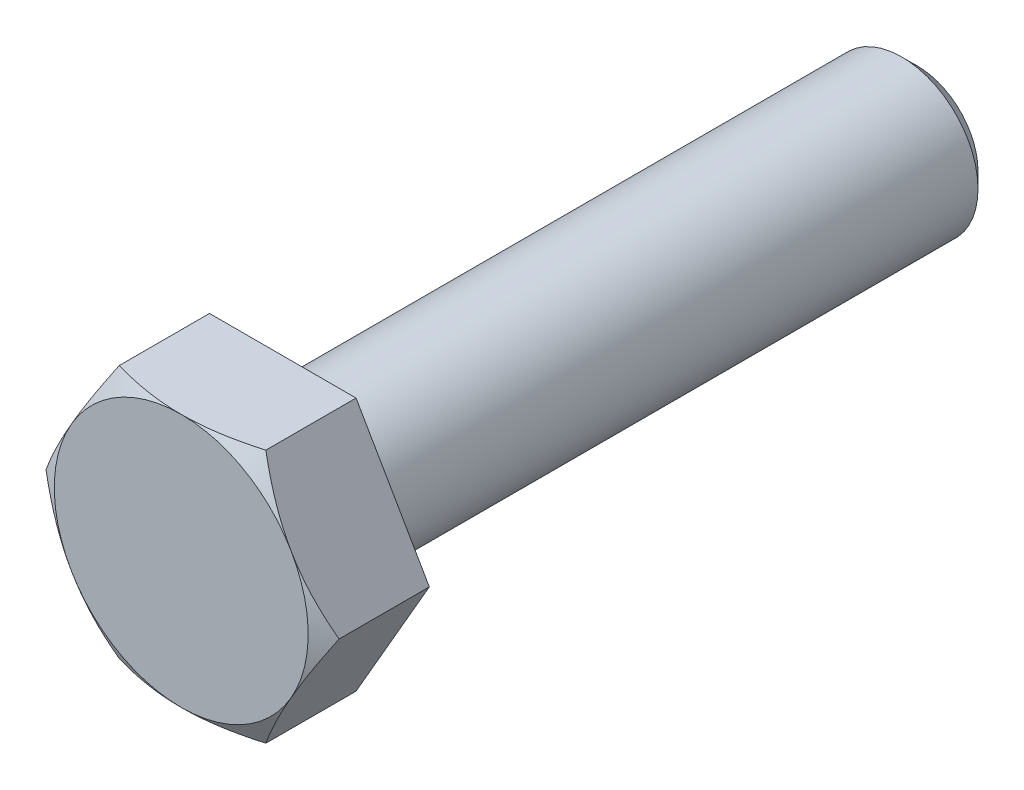
ISO-10303-21;
HEADER;
FILE_DESCRIPTION(('STEP AP214'),'2;1');
FILE_NAME('part.step','',(''),(''),'','','');
FILE_SCHEMA(('AUTOMOTIVE_DESIGN { 1 0 10303 214 1 1 1 1 }'));
ENDSEC;
DATA;
#1=APPLICATION_CONTEXT('core data for automotive mechanical design processes');
#2=APPLICATION_PROTOCOL_DEFINITION('international standard','automotive_design',2000,#1);
#3=PRODUCT_CONTEXT('',#1,'mechanical');
#4=PRODUCT('Part','Part','',(#3));
#5=PRODUCT_RELATED_PRODUCT_CATEGORY('part','',(#4));
#6=PRODUCT_DEFINITION_FORMATION('','',#4);
#7=PRODUCT_DEFINITION_CONTEXT('part definition',#1,'design');
#8=PRODUCT_DEFINITION('design','',#6,#7);
#9=PRODUCT_DEFINITION_SHAPE('','',#8);
#10=(LENGTH_UNIT() NAMED_UNIT(*) SI_UNIT(.MILLI.,.METRE.));
#11=(NAMED_UNIT(*) PLANE_ANGLE_UNIT() SI_UNIT($,.RADIAN.));
#12=(NAMED_UNIT(*) SI_UNIT($,.STERADIAN.) SOLID_ANGLE_UNIT());
#13=UNCERTAINTY_MEASURE_WITH_UNIT(LENGTH_MEASURE(1.E-05),#10,'distance_accuracy_value','');
#14=(GEOMETRIC_REPRESENTATION_CONTEXT(3) GLOBAL_UNCERTAINTY_ASSIGNED_CONTEXT((#13)) GLOBAL_UNIT_ASSIGNED_CONTEXT((#10,
#11,#12)) REPRESENTATION_CONTEXT('',''));
#15=CARTESIAN_POINT('',(0.,0.,0.));
#16=DIRECTION('',(0.,0.,1.));
#17=DIRECTION('',(1.,0.,0.));
#18=AXIS2_PLACEMENT_3D('',#15,#16,#17);
#19=CARTESIAN_POINT('',(-8.66025403784365,-5.00000000000078,-4.44089209850063E-13));
#20=DIRECTION('',(0.,0.,0.999999999999998));
#21=DIRECTION('',(1.,0.,0.));
#22=AXIS2_PLACEMENT_3D('',#19,#20,#21);
#23=PLANE('',#22);
#24=CARTESIAN_POINT('',(0.,0.,0.));
#25=DIRECTION('',(0.,0.,0.999999999999998));
#26=DIRECTION('',(1.,0.,0.));
#27=AXIS2_PLACEMENT_3D('',#24,#25,#26);
#28=CIRCLE('',#27,3.25);
#29=CARTESIAN_POINT('',(3.25,0.,0.));
#30=VERTEX_POINT('',#29);
#31=EDGE_CURVE('E11',#30,#30,#28,.T.);
#32=ORIENTED_EDGE('',*,*,#31,.T.);
#33=EDGE_LOOP('',(#32));
#34=FACE_BOUND('',#33,.T.);
#35=DIRECTION('',(-0.499999999999998,-0.86602540378444,0.));
#36=VECTOR('',#35,1.);
#37=CARTESIAN_POINT('',(-2.88675134594735,4.99999999999889,-2.22044604925031E-13));
#38=LINE('',#37,#36);
#39=CARTESIAN_POINT('',(-2.88675134594735,4.99999999999889,-2.22044604925031E-13));
#40=VERTEX_POINT('',#39);
#41=CARTESIAN_POINT('',(-5.77350269189669,-7.7715611723761E-13,5.55111512312578E-13));
#42=VERTEX_POINT('',#41);
#43=EDGE_CURVE('E120',#40,#42,#38,.T.);
#44=ORIENTED_EDGE('',*,*,#43,.F.);
#45=DIRECTION('',(1.,0.,0.));
#46=VECTOR('',#45,1.);
#47=CARTESIAN_POINT('',(-2.88675134594735,4.99999999999889,-2.22044604925031E-13));
#48=LINE('',#47,#46);
#49=CARTESIAN_POINT('',(2.8867513459484,4.99999999999945,-1.11022302462516E-13));
#50=VERTEX_POINT('',#49);
#51=EDGE_CURVE('E236',#40,#50,#48,.T.);
#52=ORIENTED_EDGE('',*,*,#51,.T.);
#53=DIRECTION('',(0.5,-0.86602540378444,0.));
#54=VECTOR('',#53,1.);
#55=CARTESIAN_POINT('',(2.8867513459484,4.99999999999945,-1.11022302462516E-13));
#56=LINE('',#55,#54);
#57=CARTESIAN_POINT('',(5.77350269189625,-5.55111512312578E-13,2.22044604925031E-13));
#58=VERTEX_POINT('',#57);
#59=EDGE_CURVE('E233',#50,#58,#56,.T.);
#60=ORIENTED_EDGE('',*,*,#59,.T.);
#61=DIRECTION('',(-0.499999999999999,-0.866025403784439,0.));
#62=VECTOR('',#61,1.);
#63=CARTESIAN_POINT('',(5.77350269189625,-5.55111512312578E-13,2.22044604925031E-13));
#64=LINE('',#63,#62);
#65=CARTESIAN_POINT('',(2.88675134594885,-5.00000000000067,-4.44089209850063E-13));
#66=VERTEX_POINT('',#65);
#67=EDGE_CURVE('E230',#58,#66,#64,.T.);
#68=ORIENTED_EDGE('',*,*,#67,.T.);
#69=DIRECTION('',(1.,0.,0.));
#70=VECTOR('',#69,1.);
#71=CARTESIAN_POINT('',(-2.88675134594774,-5.00000000000089,-3.33066907387547E-13));
#72=LINE('',#71,#70);
#73=CARTESIAN_POINT('',(-2.88675134594774,-5.00000000000089,-3.33066907387547E-13));
#74=VERTEX_POINT('',#73);
#75=EDGE_CURVE('E227',#74,#66,#72,.T.);
#76=ORIENTED_EDGE('',*,*,#75,.F.);
#77=DIRECTION('',(0.5,-0.86602540378444,0.));
#78=VECTOR('',#77,1.);
#79=CARTESIAN_POINT('',(-5.77350269189669,-7.7715611723761E-13,5.55111512312578E-13));
#80=LINE('',#79,#78);
#81=EDGE_CURVE('E225',#42,#74,#80,.T.);
#82=ORIENTED_EDGE('',*,*,#81,.F.);
#83=EDGE_LOOP('',(#44,#52,#60,#68,#76,#82));
#84=FACE_BOUND('',#83,.T.);
#85=ADVANCED_FACE('F28',(#34,#84),#23,.F.);
#86=CARTESIAN_POINT('',(-2.8867513459479,4.99999999999912,4.));
#87=DIRECTION('',(0.866025403784439,-0.5,0.));
#88=DIRECTION('',(0.499999999999998,0.86602540378444,0.));
#89=AXIS2_PLACEMENT_3D('',#86,#87,#88);
#90=PLANE('',#89);
#91=DIRECTION('',(0.,0.,-0.999999999999998));
#92=VECTOR('',#91,1.);
#93=CARTESIAN_POINT('',(-5.77350269189558,-2.22044604925031E-13,3.99999999999956));
#94=LINE('',#93,#92);
#95=CARTESIAN_POINT('',(-5.77350269189553,-4.9960036108132E-13,3.55341801261422));
#96=VERTEX_POINT('',#95);
#97=EDGE_CURVE('E114',#96,#42,#94,.T.);
#98=ORIENTED_EDGE('',*,*,#97,.F.);
#99=CARTESIAN_POINT('',(-5.77361816195054,-0.000200000000838418,3.55335134394807));
#100=CARTESIAN_POINT('',(-5.6467543346508,0.219534594524183,3.62661343236213));
#101=CARTESIAN_POINT('',(-5.51880543790584,0.441148584458509,3.69324867808165));
#102=CARTESIAN_POINT('',(-5.26069210252303,0.888213995452372,3.80956100898894));
#103=CARTESIAN_POINT('',(-5.13052307794711,1.11367335958963,3.859196950084));
#104=CARTESIAN_POINT('',(-4.87177839004636,1.56183230522235,3.93644897458112));
#105=CARTESIAN_POINT('',(-4.74324302208383,1.78446209310302,3.96457962171632));
#106=CARTESIAN_POINT('',(-4.54998783160111,2.11918990184544,3.98980507804623));
#107=CARTESIAN_POINT('',(-4.48552534905121,2.23084219680385,3.99538654023049));
#108=CARTESIAN_POINT('',(-4.35654081066908,2.45424997067261,4.0007977832484));
#109=CARTESIAN_POINT('',(-4.29201875673852,2.56600544628915,4.0006277417415));
#110=CARTESIAN_POINT('',(-4.11524635305247,2.87218423084956,3.99224636820756));
#111=CARTESIAN_POINT('',(-4.00305457769137,3.06650608596616,3.97817022810265));
#112=CARTESIAN_POINT('',(-3.77941563226436,3.45386010199674,3.93353474289069));
#113=CARTESIAN_POINT('',(-3.66796924828397,3.64689090137066,3.90296013985252));
#114=CARTESIAN_POINT('',(-3.44387972423116,4.03502534247405,3.82653150637885));
#115=CARTESIAN_POINT('',(-3.33126486598646,4.23007999864098,3.78035362112141));
#116=CARTESIAN_POINT('',(-3.10771464157907,4.61728034535812,3.67554820550798));
#117=CARTESIAN_POINT('',(-2.99677641204821,4.8094309954075,3.61694529656229));
#118=CARTESIAN_POINT('',(-2.88663587589427,5.00019999999946,3.55335134394719));
#119=B_SPLINE_CURVE_WITH_KNOTS('',3,(#99,#100,#101,#102,#103,#104,#105,#106,#107,#108,#109,#110,
#111,#112,#113,#114,#115,#116,#117,#118),.UNSPECIFIED.,.F.,.F.,(4,2,2,2,2,2,2,2,2,4),(0.,
0.792555841363103,1.58701660053329,2.36181537487272,2.74884076077317,3.13585419177287,
3.80962362599691,4.48401723901218,5.17336882348975,5.86136694793795),.UNSPECIFIED.);
#120=CARTESIAN_POINT('',(-4.33012701892188,2.49999999999928,3.99999999999956));
#121=VERTEX_POINT('',#120);
#122=EDGE_CURVE('E99',#96,#121,#119,.T.);
#123=ORIENTED_EDGE('',*,*,#122,.T.);
#124=CARTESIAN_POINT('',(-2.8867513459479,4.99999999999934,3.55341801261488));
#125=VERTEX_POINT('',#124);
#126=EDGE_CURVE('E107',#121,#125,#119,.T.);
#127=ORIENTED_EDGE('',*,*,#126,.T.);
#128=DIRECTION('',(0.,0.,-0.999999999999998));
#129=VECTOR('',#128,1.);
#130=CARTESIAN_POINT('',(-2.8867513459479,4.99999999999912,4.));
#131=LINE('',#130,#129);
#132=EDGE_CURVE('E239',#125,#40,#131,.T.);
#133=ORIENTED_EDGE('',*,*,#132,.T.);
#134=ORIENTED_EDGE('',*,*,#43,.T.);
#135=EDGE_LOOP('',(#98,#123,#127,#133,#134));
#136=FACE_BOUND('',#135,.T.);
#137=ADVANCED_FACE('F30',(#136),#90,.F.);
#138=CARTESIAN_POINT('',(-5.77350269189558,-2.22044604925031E-13,3.99999999999956));
#139=DIRECTION('',(0.866025403784438,0.5,0.));
#140=DIRECTION('',(-0.5,0.86602540378444,0.));
#141=AXIS2_PLACEMENT_3D('',#138,#139,#140);
#142=PLANE('',#141);
#143=DIRECTION('',(0.,0.,-0.999999999999998));
#144=VECTOR('',#143,1.);
#145=CARTESIAN_POINT('',(-2.88675134594812,-5.00000000000095,4.));
#146=LINE('',#145,#144);
#147=CARTESIAN_POINT('',(-2.8867513459479,-5.00000000000056,3.55341801261411));
#148=VERTEX_POINT('',#147);
#149=EDGE_CURVE('E122',#148,#74,#146,.T.);
#150=ORIENTED_EDGE('',*,*,#149,.F.);
#151=CARTESIAN_POINT('',(-2.88663587589388,-5.00020000000079,3.55335134394796));
#152=CARTESIAN_POINT('',(-3.01349970319301,-4.78046540547547,3.6266134323621));
#153=CARTESIAN_POINT('',(-3.14144859993767,-4.55885141554102,3.69324867808164));
#154=CARTESIAN_POINT('',(-3.39956193532023,-4.11178600454709,3.80956100898896));
#155=CARTESIAN_POINT('',(-3.52973095989618,-3.88632664040989,3.85919695008401));
#156=CARTESIAN_POINT('',(-3.78847564779702,-3.4381676947773,3.9364489745811));
#157=CARTESIAN_POINT('',(-3.91701101575963,-3.2155379068967,3.96457962171629));
#158=CARTESIAN_POINT('',(-4.11026620624211,-2.88081009815419,3.98980507804624));
#159=CARTESIAN_POINT('',(-4.17472868879187,-2.76915780319571,3.99538654023052));
#160=CARTESIAN_POINT('',(-4.30371322717439,-2.54575002932721,4.00079778324837));
#161=CARTESIAN_POINT('',(-4.36823528110548,-2.43399455371098,4.00062774174141));
#162=CARTESIAN_POINT('',(-4.54500768479196,-2.12781576915082,3.99224636820742));
#163=CARTESIAN_POINT('',(-4.65719946015221,-1.93349391403373,3.97817022810262));
#164=CARTESIAN_POINT('',(-4.8808384055786,-1.5461398980028,3.93353474289076));
#165=CARTESIAN_POINT('',(-4.99228478955922,-1.35310909862902,3.90296013985258));
#166=CARTESIAN_POINT('',(-5.21637431361216,-0.964974657525722,3.82653150637888));
#167=CARTESIAN_POINT('',(-5.32898917185674,-0.76992000135874,3.78035362112142));
#168=CARTESIAN_POINT('',(-5.55253939626422,-0.382719654641652,3.67554820550809));
#169=CARTESIAN_POINT('',(-5.66347762579529,-0.190569004592378,3.61694529656251));
#170=CARTESIAN_POINT('',(-5.77361816194993,0.000199999999228595,3.55335134394763));
#171=B_SPLINE_CURVE_WITH_KNOTS('',3,(#151,#152,#153,#154,#155,#156,#157,#158,#159,#160,#161,
#162,#163,#164,#165,#166,#167,#168,#169,#170),.UNSPECIFIED.,.F.,.F.,(4,2,2,2,2,2,2,2,2,4),(0.,
0.792555841363012,1.58701660053309,2.36181537487245,2.74884076077285,3.13585419177252,
3.80962362599656,4.48401723901181,5.17336882348935,5.86136694793752),.UNSPECIFIED.);
#172=CARTESIAN_POINT('',(-4.33012701892194,-2.5000000000005,3.99999999999912));
#173=VERTEX_POINT('',#172);
#174=EDGE_CURVE('E116',#148,#173,#171,.T.);
#175=ORIENTED_EDGE('',*,*,#174,.T.);
#176=EDGE_CURVE('E52',#173,#96,#171,.T.);
#177=ORIENTED_EDGE('',*,*,#176,.T.);
#178=ORIENTED_EDGE('',*,*,#97,.T.);
#179=ORIENTED_EDGE('',*,*,#81,.T.);
#180=EDGE_LOOP('',(#150,#175,#177,#178,#179));
#181=FACE_BOUND('',#180,.T.);
#182=ADVANCED_FACE('F112',(#181),#142,.F.);
#183=CARTESIAN_POINT('',(-2.88675134594812,-5.00000000000095,4.));
#184=DIRECTION('',(0.,1.,0.));
#185=DIRECTION('',(0.,0.,0.999999999999998));
#186=AXIS2_PLACEMENT_3D('',#183,#184,#185);
#187=PLANE('',#186);
#188=DIRECTION('',(0.,0.,-0.999999999999998));
#189=VECTOR('',#188,1.);
#190=CARTESIAN_POINT('',(2.88675134594818,-5.000000000001,4.00000000000023));
#191=LINE('',#190,#189);
#192=CARTESIAN_POINT('',(2.88675134594835,-5.00000000000028,3.55341801261466));
#193=VERTEX_POINT('',#192);
#194=EDGE_CURVE('E128',#193,#66,#191,.T.);
#195=ORIENTED_EDGE('',*,*,#194,.F.);
#196=CARTESIAN_POINT('',(-7.65608998744843,-5.00000000000045,1.60736647344928));
#197=CARTESIAN_POINT('',(-7.43656171400134,-5.00000000000077,1.71345466182769));
#198=CARTESIAN_POINT('',(-7.21651440169987,-5.0000000000009,1.81848824538367));
#199=CARTESIAN_POINT('',(-6.77510105921485,-5.000000000001,2.02584356635973));
#200=CARTESIAN_POINT('',(-6.55373480873023,-5.00000000000096,2.12816483425382));
#201=CARTESIAN_POINT('',(-6.10820714710329,-5.00000000000094,2.3300319214646));
#202=CARTESIAN_POINT('',(-5.88403698971094,-5.00000000000095,2.4295585071822));
#203=CARTESIAN_POINT('',(-5.43385418074642,-5.00000000000095,2.62433676721268));
#204=CARTESIAN_POINT('',(-5.20784162594241,-5.00000000000095,2.71958866435707));
#205=CARTESIAN_POINT('',(-4.75080884782714,-5.00000000000095,2.90581169081008));
#206=CARTESIAN_POINT('',(-4.51976121099459,-5.00000000000096,2.99671590900078));
#207=CARTESIAN_POINT('',(-4.05494053422047,-5.00000000000094,3.17140469702756));
#208=CARTESIAN_POINT('',(-3.82116719433968,-5.00000000000092,3.2551884747519));
#209=CARTESIAN_POINT('',(-3.35100416711824,-5.00000000000098,3.41338536763481));
#210=CARTESIAN_POINT('',(-3.11462125088118,-5.00000000000105,3.487818404774));
#211=CARTESIAN_POINT('',(-2.63849247869963,-5.00000000000084,3.62489560612725));
#212=CARTESIAN_POINT('',(-2.39874771210284,-5.00000000000056,3.68754349840319));
#213=CARTESIAN_POINT('',(-1.91574303714458,-5.00000000000056,3.79801224600521));
#214=CARTESIAN_POINT('',(-1.67248221084053,-5.00000000000085,3.84582915344087));
#215=CARTESIAN_POINT('',(-1.18299359688614,-5.00000000000105,3.92340444420669));
#216=CARTESIAN_POINT('',(-0.936765806612823,-5.00000000000096,3.95316281157084));
#217=CARTESIAN_POINT('',(-0.567032279323428,-5.00000000000094,3.98234879841296));
#218=CARTESIAN_POINT('',(-0.444105297658137,-5.00000000000095,3.98950368093927));
#219=CARTESIAN_POINT('',(-0.198053005238181,-5.00000000000094,3.99860454773021));
#220=CARTESIAN_POINT('',(-0.074927697079846,-5.00000000000091,4.00055059963894));
#221=CARTESIAN_POINT('',(0.171257999892685,-5.00000000000098,3.99918152965345));
#222=CARTESIAN_POINT('',(0.294318397227371,-5.00000000000109,3.99586788568583));
#223=CARTESIAN_POINT('',(0.540192730789101,-5.0000000000008,3.98406340271682));
#224=CARTESIAN_POINT('',(0.66300665426377,-5.00000000000041,3.97557230243043));
#225=CARTESIAN_POINT('',(0.960681872881858,-5.00000000000023,3.9488936197258));
#226=CARTESIAN_POINT('',(1.13531436279939,-5.00000000000075,3.92811103230146));
#227=CARTESIAN_POINT('',(1.4832167579937,-5.00000000000114,3.87723434427609));
#228=CARTESIAN_POINT('',(1.65648647841219,-5.000000000001,3.84713900200912));
#229=CARTESIAN_POINT('',(2.00155426058684,-5.00000000000089,3.77870120798789));
#230=CARTESIAN_POINT('',(2.17335067370359,-5.00000000000093,3.74035052251295));
#231=CARTESIAN_POINT('',(2.51518168221042,-5.00000000000096,3.65657169461428));
#232=CARTESIAN_POINT('',(2.68521638419299,-5.00000000000095,3.61114398308533));
#233=CARTESIAN_POINT('',(3.02770318928887,-5.00000000000094,3.51311221794505));
#234=CARTESIAN_POINT('',(3.20011248435312,-5.00000000000094,3.46035963617538));
#235=CARTESIAN_POINT('',(3.54310870430188,-5.00000000000095,3.34964221269669));
#236=CARTESIAN_POINT('',(3.7136967965973,-5.00000000000094,3.29168096609226));
#237=CARTESIAN_POINT('',(4.05236610267988,-5.00000000000095,3.17174345927081));
#238=CARTESIAN_POINT('',(4.22045602230064,-5.00000000000095,3.10979163457287));
#239=CARTESIAN_POINT('',(4.5553317168746,-5.00000000000094,2.98225176586133));
#240=CARTESIAN_POINT('',(4.72211693321435,-5.00000000000093,2.91666225221195));
#241=CARTESIAN_POINT('',(4.888296237334,-5.00000000000089,2.84961374182313));
#242=B_SPLINE_CURVE_WITH_KNOTS('',3,(#196,#197,#198,#199,#200,#201,#202,#203,#204,#205,#206,
#207,#208,#209,#210,#211,#212,#213,#214,#215,#216,#217,#218,#219,#220,#221,#222,#223,#224,#225,
#226,#227,#228,#229,#230,#231,#232,#233,#234,#235,#236,#237,#238,#239,#240,#241),.UNSPECIFIED.,
.F.,.F.,(4,2,2,2,2,2,2,2,2,2,2,2,2,2,2,2,2,2,2,2,2,2,4),(0.,0.731464740665235,1.46305528824888,
2.19883243307472,2.93457117856024,3.67934251246858,4.42419659013374,5.16743580872004,
5.91043951739349,6.65364083834803,7.3968428163851,7.76615414335445,8.13546067426597,
8.50466345177834,8.87388486298416,9.40118542949673,9.92855633109954,10.4564556797848,
10.984322899123,11.5251202808276,12.0655472210638,12.6029322754127,13.1405360390022),.UNSPECIFIED.);
#243=CARTESIAN_POINT('',(2.77555756156289E-13,-5.00000000000145,4.00000000000023));
#244=VERTEX_POINT('',#243);
#245=EDGE_CURVE('E202',#193,#244,#242,.F.);
#246=ORIENTED_EDGE('',*,*,#245,.T.);
#247=EDGE_CURVE('E44',#244,#148,#242,.F.);
#248=ORIENTED_EDGE('',*,*,#247,.T.);
#249=ORIENTED_EDGE('',*,*,#149,.T.);
#250=ORIENTED_EDGE('',*,*,#75,.T.);
#251=EDGE_LOOP('',(#195,#246,#248,#249,#250));
#252=FACE_BOUND('',#251,.T.);
#253=ADVANCED_FACE('F210',(#252),#187,.F.);
#254=CARTESIAN_POINT('',(5.77350269189686,-1.0547118733939E-12,3.99999999999923));
#255=DIRECTION('',(0.866025403784439,-0.5,0.));
#256=DIRECTION('',(0.499999999999999,0.866025403784439,0.));
#257=AXIS2_PLACEMENT_3D('',#254,#255,#256);
#258=PLANE('',#257);
#259=CARTESIAN_POINT('',(2.88663587589438,-5.00020000000112,3.55335134394796));
#260=CARTESIAN_POINT('',(3.01349970319406,-4.78046540547594,3.62661343236169));
#261=CARTESIAN_POINT('',(3.141448599939,-4.55885141554155,3.69324867808104));
#262=CARTESIAN_POINT('',(3.39956193532183,-4.11178600454759,3.80956100898819));
#263=CARTESIAN_POINT('',(3.52973095989779,-3.8863266404103,3.85919695008328));
#264=CARTESIAN_POINT('',(3.78847564779859,-3.43816769477748,3.93644897458045));
#265=CARTESIAN_POINT('',(3.91701101576115,-3.21553790689674,3.96457962171567));
#266=CARTESIAN_POINT('',(4.11026620624393,-2.88081009815426,3.98980507804545));
#267=CARTESIAN_POINT('',(4.17472868879385,-2.76915780319584,3.99538654022963));
#268=CARTESIAN_POINT('',(4.30371322717596,-2.54575002932702,4.00079778324773));
#269=CARTESIAN_POINT('',(4.36823528110647,-2.43399455371043,4.0006277417411));
#270=CARTESIAN_POINT('',(4.54500768479244,-2.12781576915006,3.99224636820736));
#271=CARTESIAN_POINT('',(4.65719946015358,-1.93349391403361,3.97817022810199));
#272=CARTESIAN_POINT('',(4.88083840558057,-1.54613989800322,3.93353474288973));
#273=CARTESIAN_POINT('',(4.99228478956091,-1.35310909862934,3.90296013985172));
#274=CARTESIAN_POINT('',(5.2163743136136,-0.964974657526078,3.8265315063781));
#275=CARTESIAN_POINT('',(5.32898917185825,-0.769920001359244,3.78035362112054));
#276=CARTESIAN_POINT('',(5.5525393962656,-0.382719654642218,3.67554820550746));
#277=CARTESIAN_POINT('',(5.66347762579649,-0.190569004592859,3.61694529656223));
#278=CARTESIAN_POINT('',(5.77361816195054,0.000199999999228595,3.5533513439483));
#279=B_SPLINE_CURVE_WITH_KNOTS('',3,(#259,#260,#261,#262,#263,#264,#265,#266,#267,#268,#269,
#270,#271,#272,#273,#274,#275,#276,#277,#278),.UNSPECIFIED.,.F.,.F.,(4,2,2,2,2,2,2,2,2,4),(0.,
0.792555841363132,1.58701660053348,2.3618153748731,2.74884076077361,3.13585419177336,
3.80962362599713,4.48401723901219,5.1733688234895,5.86136694793733),.UNSPECIFIED.);
#280=CARTESIAN_POINT('',(4.33012701892199,-2.50000000000061,3.99999999999978));
#281=VERTEX_POINT('',#280);
#282=EDGE_CURVE('E201',#193,#281,#279,.T.);
#283=ORIENTED_EDGE('',*,*,#282,.F.);
#284=ORIENTED_EDGE('',*,*,#194,.T.);
#285=ORIENTED_EDGE('',*,*,#67,.F.);
#286=DIRECTION('',(0.,0.,-0.999999999999998));
#287=VECTOR('',#286,1.);
#288=CARTESIAN_POINT('',(5.77350269189686,-1.0547118733939E-12,3.99999999999923));
#289=LINE('',#288,#287);
#290=CARTESIAN_POINT('',(5.77350269189658,0.,3.55341801261511));
#291=VERTEX_POINT('',#290);
#292=EDGE_CURVE('E243',#291,#58,#289,.T.);
#293=ORIENTED_EDGE('',*,*,#292,.F.);
#294=EDGE_CURVE('E196',#281,#291,#279,.T.);
#295=ORIENTED_EDGE('',*,*,#294,.F.);
#296=EDGE_LOOP('',(#283,#284,#285,#293,#295));
#297=FACE_BOUND('',#296,.T.);
#298=ADVANCED_FACE('F207',(#297),#258,.T.);
#299=CARTESIAN_POINT('',(2.88675134594796,4.99999999999912,4.00000000000034));
#300=DIRECTION('',(0.866025403784438,0.5,0.));
#301=DIRECTION('',(-0.5,0.86602540378444,0.));
#302=AXIS2_PLACEMENT_3D('',#299,#300,#301);
#303=PLANE('',#302);
#304=CARTESIAN_POINT('',(5.77361816195049,-0.000200000000338818,3.55335134394785));
#305=CARTESIAN_POINT('',(5.64675433465074,0.219534594524574,3.62661343236215));
#306=CARTESIAN_POINT('',(5.51880543790576,0.441148584458827,3.69324867808176));
#307=CARTESIAN_POINT('',(5.26069210252293,0.888213995452583,3.80956100898911));
#308=CARTESIAN_POINT('',(5.13052307794702,1.11367335958981,3.85919695008413));
#309=CARTESIAN_POINT('',(4.87177839004638,1.5618323052225,3.93644897458119));
#310=CARTESIAN_POINT('',(4.74324302208394,1.78446209310317,3.96457962171637));
#311=CARTESIAN_POINT('',(4.5499878316011,2.11918990184545,3.98980507804632));
#312=CARTESIAN_POINT('',(4.48552534905112,2.23084219680379,3.9953865402306));
#313=CARTESIAN_POINT('',(4.35654081066929,2.45424997067268,4.00079778324843));
#314=CARTESIAN_POINT('',(4.29201875673912,2.56600544628943,4.00062774174142));
#315=CARTESIAN_POINT('',(4.11524635305339,2.87218423085001,3.99224636820739));
#316=CARTESIAN_POINT('',(4.00305457769167,3.06650608596626,3.97817022810265));
#317=CARTESIAN_POINT('',(3.77941563226421,3.45386010199657,3.93353474289081));
#318=CARTESIAN_POINT('',(3.66796924828399,3.64689090137058,3.90296013985259));
#319=CARTESIAN_POINT('',(3.44387972423131,4.03502534247403,3.8265315063789));
#320=CARTESIAN_POINT('',(3.33126486598656,4.23007999864094,3.78035362112149));
#321=CARTESIAN_POINT('',(3.10771464157916,4.61728034535805,3.67554820550802));
#322=CARTESIAN_POINT('',(2.99677641204832,4.80943099540742,3.61694529656227));
#323=CARTESIAN_POINT('',(2.88663587589461,5.00019999999946,3.55335134394696));
#324=B_SPLINE_CURVE_WITH_KNOTS('',3,(#304,#305,#306,#307,#308,#309,#310,#311,#312,#313,#314,
#315,#316,#317,#318,#319,#320,#321,#322,#323),.UNSPECIFIED.,.F.,.F.,(4,2,2,2,2,2,2,2,2,4),(0.,
0.792555841363021,1.58701660053308,2.36181537487238,2.74884076077277,3.13585419177242,
3.80962362599646,4.48401723901171,5.17336882348926,5.86136694793747),.UNSPECIFIED.);
#325=CARTESIAN_POINT('',(4.33012701892299,2.49999999999989,4.00000000000089));
#326=VERTEX_POINT('',#325);
#327=EDGE_CURVE('E195',#291,#326,#324,.T.);
#328=ORIENTED_EDGE('',*,*,#327,.F.);
#329=ORIENTED_EDGE('',*,*,#292,.T.);
#330=ORIENTED_EDGE('',*,*,#59,.F.);
#331=DIRECTION('',(0.,0.,-0.999999999999998));
#332=VECTOR('',#331,1.);
#333=CARTESIAN_POINT('',(2.88675134594796,4.99999999999912,4.00000000000034));
#334=LINE('',#333,#332);
#335=CARTESIAN_POINT('',(2.88675134594796,4.99999999999973,3.55341801261466));
#336=VERTEX_POINT('',#335);
#337=EDGE_CURVE('E241',#336,#50,#334,.T.);
#338=ORIENTED_EDGE('',*,*,#337,.F.);
#339=EDGE_CURVE('E190',#326,#336,#324,.T.);
#340=ORIENTED_EDGE('',*,*,#339,.F.);
#341=EDGE_LOOP('',(#328,#329,#330,#338,#340));
#342=FACE_BOUND('',#341,.T.);
#343=ADVANCED_FACE('F177',(#342),#303,.T.);
#344=CARTESIAN_POINT('',(-2.8867513459479,4.99999999999912,4.));
#345=DIRECTION('',(0.,1.,0.));
#346=DIRECTION('',(0.,0.,0.999999999999998));
#347=AXIS2_PLACEMENT_3D('',#344,#345,#346);
#348=PLANE('',#347);
#349=CARTESIAN_POINT('',(-7.65608998744793,4.99999999999901,1.60736647344972));
#350=CARTESIAN_POINT('',(-7.43656171400088,4.99999999999908,1.7134546618283));
#351=CARTESIAN_POINT('',(-7.21651440169941,4.9999999999991,1.81848824538435));
#352=CARTESIAN_POINT('',(-6.77510105921437,4.99999999999913,2.02584356636049));
#353=CARTESIAN_POINT('',(-6.55373480872972,4.99999999999912,2.12816483425459));
#354=CARTESIAN_POINT('',(-6.10820714710276,4.99999999999911,2.33003192146537));
#355=CARTESIAN_POINT('',(-5.88403698971043,4.99999999999911,2.42955850718298));
#356=CARTESIAN_POINT('',(-5.43385418074594,4.99999999999912,2.62433676721347));
#357=CARTESIAN_POINT('',(-5.20784162594194,4.99999999999912,2.71958866435786));
#358=CARTESIAN_POINT('',(-4.75080884782678,4.99999999999911,2.90581169081084));
#359=CARTESIAN_POINT('',(-4.51976121099434,4.99999999999911,2.99671590900152));
#360=CARTESIAN_POINT('',(-4.05494053422041,4.99999999999912,3.17140469702824));
#361=CARTESIAN_POINT('',(-3.82116719433973,4.99999999999913,3.25518847475255));
#362=CARTESIAN_POINT('',(-3.35100416711847,4.9999999999991,3.41338536763546));
#363=CARTESIAN_POINT('',(-3.11462125088149,4.99999999999907,3.48781840477466));
#364=CARTESIAN_POINT('',(-2.63849247870007,4.99999999999916,3.62489560612786));
#365=CARTESIAN_POINT('',(-2.39874771210333,4.99999999999928,3.68754349840373));
#366=CARTESIAN_POINT('',(-1.91574303714513,4.99999999999928,3.79801224600579));
#367=CARTESIAN_POINT('',(-1.6724822108411,4.99999999999916,3.84582915344156));
#368=CARTESIAN_POINT('',(-1.18299359688676,4.99999999999907,3.92340444420747));
#369=CARTESIAN_POINT('',(-0.936765806613473,4.99999999999911,3.95316281157159));
#370=CARTESIAN_POINT('',(-0.567032279324096,4.99999999999912,3.98234879841378));
#371=CARTESIAN_POINT('',(-0.444105297658788,4.99999999999912,3.98950368094014));
#372=CARTESIAN_POINT('',(-0.198053005238825,4.99999999999912,3.99860454773101));
#373=CARTESIAN_POINT('',(-0.0749276970805007,4.99999999999913,4.00055059963962));
#374=CARTESIAN_POINT('',(0.171257999892082,4.9999999999991,3.99918152965449));
#375=CARTESIAN_POINT('',(0.294318397226829,4.99999999999907,3.99586788568733));
#376=CARTESIAN_POINT('',(0.540192730788555,4.99999999999917,3.98406340271709));
#377=CARTESIAN_POINT('',(0.66300665426316,4.99999999999931,3.975572302429));
#378=CARTESIAN_POINT('',(0.960681872881431,4.99999999999938,3.94889361972352));
#379=CARTESIAN_POINT('',(1.13531436279934,4.99999999999919,3.92811103230146));
#380=CARTESIAN_POINT('',(1.48321675799404,4.99999999999905,3.87723434427771));
#381=CARTESIAN_POINT('',(1.65648647841254,4.9999999999991,3.84713900201011));
#382=CARTESIAN_POINT('',(2.00155426058724,4.99999999999914,3.77870120798838));
#383=CARTESIAN_POINT('',(2.17335067370401,4.99999999999912,3.74035052251358));
#384=CARTESIAN_POINT('',(2.51518168221089,4.99999999999911,3.65657169461499));
#385=CARTESIAN_POINT('',(2.6852163841935,4.99999999999912,3.61114398308596));
#386=CARTESIAN_POINT('',(3.02770318928933,4.99999999999912,3.51311221794563));
#387=CARTESIAN_POINT('',(3.20011248435351,4.99999999999912,3.46035963617599));
#388=CARTESIAN_POINT('',(3.54310870430213,4.99999999999912,3.34964221269729));
#389=CARTESIAN_POINT('',(3.71369679659749,4.99999999999914,3.29168096609283));
#390=CARTESIAN_POINT('',(4.05236610268012,4.9999999999991,3.17174345927143));
#391=CARTESIAN_POINT('',(4.22045602230099,4.99999999999905,3.10979163457356));
#392=CARTESIAN_POINT('',(4.55533171687492,4.99999999999919,2.98225176586167));
#393=CARTESIAN_POINT('',(4.72211693321455,4.99999999999938,2.91666225221186));
#394=CARTESIAN_POINT('',(4.88829623733383,4.99999999999984,2.84961374182202));
#395=B_SPLINE_CURVE_WITH_KNOTS('',3,(#349,#350,#351,#352,#353,#354,#355,#356,#357,#358,#359,
#360,#361,#362,#363,#364,#365,#366,#367,#368,#369,#370,#371,#372,#373,#374,#375,#376,#377,#378,
#379,#380,#381,#382,#383,#384,#385,#386,#387,#388,#389,#390,#391,#392,#393,#394),.UNSPECIFIED.,
.F.,.F.,(4,2,2,2,2,2,2,2,2,2,2,2,2,2,2,2,2,2,2,2,2,2,4),(0.,0.731464740665329,1.46305528824906,
2.19883243307486,2.93457117856035,3.67934251246838,4.42419659013323,5.16743580871931,
5.91043951739257,6.65364083834713,7.39684281638409,7.76615414335349,8.13546067426501,
8.50466345177746,8.87388486298346,9.40118542949645,9.92855633109951,10.4564556797848,
10.9843228991231,11.5251202808275,12.0655472210635,12.6029322754127,13.1405360390023),.UNSPECIFIED.);
#396=CARTESIAN_POINT('',(2.22044604925031E-13,4.9999999999995,3.99999999999978));
#397=VERTEX_POINT('',#396);
#398=EDGE_CURVE('E188',#336,#397,#395,.F.);
#399=ORIENTED_EDGE('',*,*,#398,.F.);
#400=ORIENTED_EDGE('',*,*,#337,.T.);
#401=ORIENTED_EDGE('',*,*,#51,.F.);
#402=ORIENTED_EDGE('',*,*,#132,.F.);
#403=EDGE_CURVE('E182',#397,#125,#395,.F.);
#404=ORIENTED_EDGE('',*,*,#403,.F.);
#405=EDGE_LOOP('',(#399,#400,#401,#402,#404));
#406=FACE_BOUND('',#405,.T.);
#407=ADVANCED_FACE('F172',(#406),#348,.T.);
#408=CARTESIAN_POINT('',(1.11022302462516E-13,-1.66533453693773E-13,3.99999999999967));
#409=DIRECTION('',(0.,0.,-0.999999999999998));
#410=DIRECTION('',(-1.,0.,0.));
#411=AXIS2_PLACEMENT_3D('',#408,#409,#410);
#412=CONICAL_SURFACE('',#411,5.,1.0471975511966);
#413=ORIENTED_EDGE('',*,*,#294,.T.);
#414=ORIENTED_EDGE('',*,*,#327,.T.);
#415=CARTESIAN_POINT('',(1.11022302462516E-13,-1.66533453693773E-13,3.99999999999967));
#416=DIRECTION('',(0.,0.,0.999999999999998));
#417=DIRECTION('',(1.,0.,0.));
#418=AXIS2_PLACEMENT_3D('',#415,#416,#417);
#419=CIRCLE('',#418,5.);
#420=EDGE_CURVE('E121',#326,#281,#419,.F.);
#421=ORIENTED_EDGE('',*,*,#420,.T.);
#422=EDGE_LOOP('',(#413,#414,#421));
#423=FACE_BOUND('',#422,.T.);
#424=ADVANCED_FACE('F176',(#423),#412,.T.);
#425=ORIENTED_EDGE('',*,*,#339,.T.);
#426=ORIENTED_EDGE('',*,*,#398,.T.);
#427=EDGE_CURVE('E125',#397,#326,#419,.F.);
#428=ORIENTED_EDGE('',*,*,#427,.T.);
#429=EDGE_LOOP('',(#425,#426,#428));
#430=FACE_BOUND('',#429,.T.);
#431=ADVANCED_FACE('F164',(#430),#412,.T.);
#432=CARTESIAN_POINT('',(1.11022302462516E-13,-1.66533453693773E-13,3.99999999999967));
#433=DIRECTION('',(0.,0.,-0.999999999999998));
#434=DIRECTION('',(-1.,0.,0.));
#435=AXIS2_PLACEMENT_3D('',#432,#433,#434);
#436=CIRCLE('',#435,5.);
#437=EDGE_CURVE('E189',#121,#397,#436,.T.);
#438=ORIENTED_EDGE('',*,*,#437,.T.);
#439=ORIENTED_EDGE('',*,*,#403,.T.);
#440=ORIENTED_EDGE('',*,*,#126,.F.);
#441=EDGE_LOOP('',(#438,#439,#440));
#442=FACE_BOUND('',#441,.T.);
#443=ADVANCED_FACE('F270',(#442),#412,.T.);
#444=EDGE_CURVE('E102',#173,#121,#419,.F.);
#445=ORIENTED_EDGE('',*,*,#444,.T.);
#446=ORIENTED_EDGE('',*,*,#122,.F.);
#447=ORIENTED_EDGE('',*,*,#176,.F.);
#448=EDGE_LOOP('',(#445,#446,#447));
#449=FACE_BOUND('',#448,.T.);
#450=ADVANCED_FACE('F100',(#449),#412,.T.);
#451=ORIENTED_EDGE('',*,*,#247,.F.);
#452=EDGE_CURVE('E262',#244,#173,#419,.F.);
#453=ORIENTED_EDGE('',*,*,#452,.T.);
#454=ORIENTED_EDGE('',*,*,#174,.F.);
#455=EDGE_LOOP('',(#451,#453,#454));
#456=FACE_BOUND('',#455,.T.);
#457=ADVANCED_FACE('F273',(#456),#412,.T.);
#458=ORIENTED_EDGE('',*,*,#282,.T.);
#459=EDGE_CURVE('E127',#281,#244,#419,.F.);
#460=ORIENTED_EDGE('',*,*,#459,.T.);
#461=ORIENTED_EDGE('',*,*,#245,.F.);
#462=EDGE_LOOP('',(#458,#460,#461));
#463=FACE_BOUND('',#462,.T.);
#464=ADVANCED_FACE('F170',(#463),#412,.T.);
#465=CARTESIAN_POINT('',(-8.66025403784465,-5.00000000000078,3.99999999999978));
#466=DIRECTION('',(0.,0.,0.999999999999998));
#467=DIRECTION('',(1.,0.,0.));
#468=AXIS2_PLACEMENT_3D('',#465,#466,#467);
#469=PLANE('',#468);
#470=ORIENTED_EDGE('',*,*,#459,.F.);
#471=ORIENTED_EDGE('',*,*,#420,.F.);
#472=ORIENTED_EDGE('',*,*,#427,.F.);
#473=ORIENTED_EDGE('',*,*,#437,.F.);
#474=ORIENTED_EDGE('',*,*,#444,.F.);
#475=ORIENTED_EDGE('',*,*,#452,.F.);
#476=EDGE_LOOP('',(#470,#471,#472,#473,#474,#475));
#477=FACE_BOUND('',#476,.T.);
#478=ADVANCED_FACE('F167',(#477),#469,.T.);
#479=CARTESIAN_POINT('',(0.,-1.66533453693773E-13,-25.0000000000004));
#480=DIRECTION('',(0.,0.,0.999999999999998));
#481=DIRECTION('',(1.,0.,0.));
#482=AXIS2_PLACEMENT_3D('',#479,#480,#481);
#483=CYLINDRICAL_SURFACE('',#482,3.);
#484=CARTESIAN_POINT('',(-2.22044604925031E-13,-9.43689570931383E-13,-0.249999999999972));
#485=DIRECTION('',(0.,0.,0.999999999999998));
#486=DIRECTION('',(1.,0.,0.));
#487=AXIS2_PLACEMENT_3D('',#484,#485,#486);
#488=CIRCLE('',#487,3.);
#489=CARTESIAN_POINT('',(2.99999999999999,-1.56000212747642E-13,-0.249999999999979));
#490=VERTEX_POINT('',#489);
#491=EDGE_CURVE('E37',#490,#490,#488,.F.);
#492=CARTESIAN_POINT('',(0.,-1.33226762955019E-12,-24.3866000000006));
#493=DIRECTION('',(0.,0.,-0.999999999999998));
#494=DIRECTION('',(-1.,0.,0.));
#495=AXIS2_PLACEMENT_3D('',#492,#493,#494);
#496=CIRCLE('',#495,3.);
#497=CARTESIAN_POINT('',(2.99999999999995,-1.65379165917301E-13,-24.3866000000006));
#498=VERTEX_POINT('',#497);
#499=EDGE_CURVE('E135',#498,#498,#496,.F.);
#500=CARTESIAN_POINT('',(2.99999999999999,-1.56000212747642E-13,-0.249999999999979));
#501=CARTESIAN_POINT('',(2.99999999999999,-1.56097910176493E-13,-0.501422916666651));
#502=CARTESIAN_POINT('',(2.99999999999999,-1.56195607605343E-13,-0.752845833333323));
#503=CARTESIAN_POINT('',(2.99999999999999,-1.56391002463045E-13,-1.25569166666667));
#504=CARTESIAN_POINT('',(2.99999999999999,-1.56488699891895E-13,-1.50711458333334));
#505=CARTESIAN_POINT('',(2.99999999999999,-1.56684094749596E-13,-2.00996041666669));
#506=CARTESIAN_POINT('',(2.99999999999999,-1.56781792178447E-13,-2.26138333333336));
#507=CARTESIAN_POINT('',(2.99999999999999,-1.56977187036148E-13,-2.76422916666671));
#508=CARTESIAN_POINT('',(2.99999999999999,-1.57074884464999E-13,-3.01565208333338));
#509=CARTESIAN_POINT('',(2.99999999999999,-1.572702793227E-13,-3.51849791666673));
#510=CARTESIAN_POINT('',(2.99999999999999,-1.57367976751551E-13,-3.7699208333334));
#511=CARTESIAN_POINT('',(2.99999999999999,-1.57563371609252E-13,-4.27276666666675));
#512=CARTESIAN_POINT('',(2.99999999999999,-1.57661069038103E-13,-4.52418958333342));
#513=CARTESIAN_POINT('',(2.99999999999998,-1.57856463895804E-13,-5.02703541666677));
#514=CARTESIAN_POINT('',(2.99999999999998,-1.57954161324654E-13,-5.27845833333344));
#515=CARTESIAN_POINT('',(2.99999999999998,-1.58149556182356E-13,-5.78130416666679));
#516=CARTESIAN_POINT('',(2.99999999999998,-1.58247253611206E-13,-6.03272708333346));
#517=CARTESIAN_POINT('',(2.99999999999998,-1.58442648468907E-13,-6.53557291666681));
#518=CARTESIAN_POINT('',(2.99999999999998,-1.58540345897758E-13,-6.78699583333348));
#519=CARTESIAN_POINT('',(2.99999999999998,-1.58735740755459E-13,-7.28984166666682));
#520=CARTESIAN_POINT('',(2.99999999999998,-1.5883343818431E-13,-7.5412645833335));
#521=CARTESIAN_POINT('',(2.99999999999998,-1.59028833042011E-13,-8.04411041666684));
#522=CARTESIAN_POINT('',(2.99999999999998,-1.59126530470862E-13,-8.29553333333352));
#523=CARTESIAN_POINT('',(2.99999999999998,-1.59321925328563E-13,-8.79837916666686));
#524=CARTESIAN_POINT('',(2.99999999999998,-1.59419622757414E-13,-9.04980208333354));
#525=CARTESIAN_POINT('',(2.99999999999998,-1.59615017615115E-13,-9.55264791666688));
#526=CARTESIAN_POINT('',(2.99999999999998,-1.59712715043965E-13,-9.80407083333355));
#527=CARTESIAN_POINT('',(2.99999999999997,-1.59908109901667E-13,-10.3069166666669));
#528=CARTESIAN_POINT('',(2.99999999999997,-1.60005807330517E-13,-10.5583395833336));
#529=CARTESIAN_POINT('',(2.99999999999997,-1.60201202188219E-13,-11.0611854166669));
#530=CARTESIAN_POINT('',(2.99999999999997,-1.60298899617069E-13,-11.3126083333336));
#531=CARTESIAN_POINT('',(2.99999999999997,-1.6049429447477E-13,-11.8154541666669));
#532=CARTESIAN_POINT('',(2.99999999999997,-1.60591991903621E-13,-12.0668770833336));
#533=CARTESIAN_POINT('',(2.99999999999997,-1.60787386761322E-13,-12.569722916667));
#534=CARTESIAN_POINT('',(2.99999999999997,-1.60885084190173E-13,-12.8211458333336));
#535=CARTESIAN_POINT('',(2.99999999999997,-1.61080479047874E-13,-13.323991666667));
#536=CARTESIAN_POINT('',(2.99999999999997,-1.61178176476725E-13,-13.5754145833337));
#537=CARTESIAN_POINT('',(2.99999999999997,-1.61373571334426E-13,-14.078260416667));
#538=CARTESIAN_POINT('',(2.99999999999997,-1.61471268763276E-13,-14.3296833333337));
#539=CARTESIAN_POINT('',(2.99999999999997,-1.61666663620978E-13,-14.832529166667));
#540=CARTESIAN_POINT('',(2.99999999999997,-1.61764361049828E-13,-15.0839520833337));
#541=CARTESIAN_POINT('',(2.99999999999996,-1.6195975590753E-13,-15.586797916667));
#542=CARTESIAN_POINT('',(2.99999999999996,-1.6205745333638E-13,-15.8382208333337));
#543=CARTESIAN_POINT('',(2.99999999999996,-1.62252848194081E-13,-16.3410666666671));
#544=CARTESIAN_POINT('',(2.99999999999996,-1.62350545622932E-13,-16.5924895833337));
#545=CARTESIAN_POINT('',(2.99999999999996,-1.62545940480633E-13,-17.0953354166671));
#546=CARTESIAN_POINT('',(2.99999999999996,-1.62643637909484E-13,-17.3467583333337));
#547=CARTESIAN_POINT('',(2.99999999999996,-1.62839032767185E-13,-17.8496041666671));
#548=CARTESIAN_POINT('',(2.99999999999996,-1.62936730196036E-13,-18.1010270833338));
#549=CARTESIAN_POINT('',(2.99999999999996,-1.63132125053737E-13,-18.6038729166671));
#550=CARTESIAN_POINT('',(2.99999999999996,-1.63229822482588E-13,-18.8552958333338));
#551=CARTESIAN_POINT('',(2.99999999999996,-1.63425217340289E-13,-19.3581416666671));
#552=CARTESIAN_POINT('',(2.99999999999996,-1.63522914769139E-13,-19.6095645833338));
#553=CARTESIAN_POINT('',(2.99999999999996,-1.63718309626841E-13,-20.1124104166672));
#554=CARTESIAN_POINT('',(2.99999999999996,-1.63816007055691E-13,-20.3638333333338));
#555=CARTESIAN_POINT('',(2.99999999999996,-1.64011401913392E-13,-20.8666791666672));
#556=CARTESIAN_POINT('',(2.99999999999995,-1.64109099342243E-13,-21.1181020833338));
#557=CARTESIAN_POINT('',(2.99999999999995,-1.64304494199944E-13,-21.6209479166672));
#558=CARTESIAN_POINT('',(2.99999999999995,-1.64402191628795E-13,-21.8723708333339));
#559=CARTESIAN_POINT('',(2.99999999999995,-1.64597586486496E-13,-22.3752166666672));
#560=CARTESIAN_POINT('',(2.99999999999995,-1.64695283915347E-13,-22.6266395833339));
#561=CARTESIAN_POINT('',(2.99999999999995,-1.64890678773048E-13,-23.1294854166672));
#562=CARTESIAN_POINT('',(2.99999999999995,-1.64988376201899E-13,-23.3809083333339));
#563=CARTESIAN_POINT('',(2.99999999999995,-1.651837710596E-13,-23.8837541666672));
#564=CARTESIAN_POINT('',(2.99999999999995,-1.6528146848845E-13,-24.1351770833339));
#565=CARTESIAN_POINT('',(2.99999999999995,-1.65379165917301E-13,-24.3866000000006));
#566=B_SPLINE_CURVE_WITH_KNOTS('',3,(#500,#501,#502,#503,#504,#505,#506,#507,#508,#509,#510,
#511,#512,#513,#514,#515,#516,#517,#518,#519,#520,#521,#522,#523,#524,#525,#526,#527,#528,#529,
#530,#531,#532,#533,#534,#535,#536,#537,#538,#539,#540,#541,#542,#543,#544,#545,#546,#547,#548,
#549,#550,#551,#552,#553,#554,#555,#556,#557,#558,#559,#560,#561,#562,#563,#564,#565),
.UNSPECIFIED.,.F.,.F.,(4,2,2,2,2,2,2,2,2,2,2,2,2,2,2,2,2,2,2,2,2,2,2,2,2,2,2,2,2,2,2,2,4),(0.,
0.754268750000016,1.50853750000004,2.26280625000006,3.01707500000008,3.7713437500001,
4.52561250000011,5.27988125000014,6.03415000000015,6.78841875000017,7.54268750000019,
8.29695625000021,9.05122500000023,9.80549375000025,10.5597625000003,11.3140312500003,
12.0683000000003,12.8225687500003,13.5768375000003,14.3311062500004,15.0853750000004,
15.8396437500004,16.5939125000004,17.3481812500004,18.1024500000005,18.8567187500005,
19.6109875000005,20.3652562500005,21.1195250000005,21.8737937500006,22.6280625000006,
23.3823312500006,24.1366000000006),.UNSPECIFIED.);
#567=EDGE_CURVE('BSEAM140',#490,#498,#566,.T.);
#568=ORIENTED_EDGE('',*,*,#491,.T.);
#569=ORIENTED_EDGE('',*,*,#499,.T.);
#570=ORIENTED_EDGE('',*,*,#567,.T.);
#571=ORIENTED_EDGE('',*,*,#567,.F.);
#572=EDGE_LOOP('',(#568,#570,#569,#571));
#573=FACE_BOUND('',#572,.T.);
#574=ADVANCED_FACE('F140',(#573),#483,.T.);
#575=CARTESIAN_POINT('',(0.,-1.66533453693773E-13,-25.0000000000004));
#576=DIRECTION('',(0.,0.,-0.999999999999998));
#577=DIRECTION('',(-1.,0.,0.));
#578=AXIS2_PLACEMENT_3D('',#575,#576,#577);
#579=PLANE('',#578);
#580=CARTESIAN_POINT('',(0.,-1.66533453693773E-13,-25.0000000000004));
#581=DIRECTION('',(0.,0.,-0.999999999999998));
#582=DIRECTION('',(-1.,0.,0.));
#583=AXIS2_PLACEMENT_3D('',#580,#581,#582);
#584=CIRCLE('',#583,2.38659999999999);
#585=CARTESIAN_POINT('',(2.38659999999993,-1.65804797669367E-13,-25.0000000000004));
#586=VERTEX_POINT('',#585);
#587=EDGE_CURVE('E132',#586,#586,#584,.T.);
#588=ORIENTED_EDGE('',*,*,#587,.T.);
#589=EDGE_LOOP('',(#588));
#590=FACE_BOUND('',#589,.T.);
#591=ADVANCED_FACE('F151',(#590),#579,.T.);
#592=CARTESIAN_POINT('',(0.,-1.66533453693773E-13,-25.0000000000004));
#593=DIRECTION('',(0.,0.,0.999999999999998));
#594=DIRECTION('',(1.,0.,0.));
#595=AXIS2_PLACEMENT_3D('',#592,#593,#594);
#596=CONICAL_SURFACE('',#595,2.38659999999999,0.785398163397454);
#597=CARTESIAN_POINT('',(2.9999999999997,-1.65379165917301E-13,-24.3866000000006));
#598=CARTESIAN_POINT('',(2.99361041666637,-1.65383599581385E-13,-24.3929895833339));
#599=CARTESIAN_POINT('',(2.98722083333304,-1.65388033245469E-13,-24.3993791666673));
#600=CARTESIAN_POINT('',(2.97444166666638,-1.65396900573637E-13,-24.4121583333339));
#601=CARTESIAN_POINT('',(2.96805208333305,-1.65401334237721E-13,-24.4185479166673));
#602=CARTESIAN_POINT('',(2.95527291666638,-1.65410201565889E-13,-24.4313270833339));
#603=CARTESIAN_POINT('',(2.94888333333305,-1.65414635229973E-13,-24.4377166666672));
#604=CARTESIAN_POINT('',(2.93610416666639,-1.65423502558141E-13,-24.4504958333339));
#605=CARTESIAN_POINT('',(2.92971458333306,-1.65427936222225E-13,-24.4568854166672));
#606=CARTESIAN_POINT('',(2.9169354166664,-1.65436803550393E-13,-24.4696645833339));
#607=CARTESIAN_POINT('',(2.91054583333307,-1.65441237214477E-13,-24.4760541666672));
#608=CARTESIAN_POINT('',(2.89776666666641,-1.65450104542645E-13,-24.4888333333339));
#609=CARTESIAN_POINT('',(2.89137708333307,-1.65454538206729E-13,-24.4952229166672));
#610=CARTESIAN_POINT('',(2.87859791666641,-1.65463405534897E-13,-24.5080020833339));
#611=CARTESIAN_POINT('',(2.87220833333308,-1.65467839198981E-13,-24.5143916666672));
#612=CARTESIAN_POINT('',(2.85942916666642,-1.65476706527149E-13,-24.5271708333339));
#613=CARTESIAN_POINT('',(2.85303958333309,-1.65481140191233E-13,-24.5335604166672));
#614=CARTESIAN_POINT('',(2.84026041666643,-1.65490007519402E-13,-24.5463395833339));
#615=CARTESIAN_POINT('',(2.8338708333331,-1.65494441183486E-13,-24.5527291666672));
#616=CARTESIAN_POINT('',(2.82109166666643,-1.65503308511654E-13,-24.5655083333339));
#617=CARTESIAN_POINT('',(2.8147020833331,-1.65507742175738E-13,-24.5718979166672));
#618=CARTESIAN_POINT('',(2.80192291666644,-1.65516609503906E-13,-24.5846770833339));
#619=CARTESIAN_POINT('',(2.79553333333311,-1.6552104316799E-13,-24.5910666666672));
#620=CARTESIAN_POINT('',(2.78275416666645,-1.65529910496158E-13,-24.6038458333338));
#621=CARTESIAN_POINT('',(2.77636458333312,-1.65534344160242E-13,-24.6102354166672));
#622=CARTESIAN_POINT('',(2.76358541666646,-1.6554321148841E-13,-24.6230145833338));
#623=CARTESIAN_POINT('',(2.75719583333312,-1.65547645152494E-13,-24.6294041666672));
#624=CARTESIAN_POINT('',(2.74441666666646,-1.65556512480662E-13,-24.6421833333338));
#625=CARTESIAN_POINT('',(2.73802708333313,-1.65560946144746E-13,-24.6485729166672));
#626=CARTESIAN_POINT('',(2.72524791666647,-1.65569813472914E-13,-24.6613520833338));
#627=CARTESIAN_POINT('',(2.71885833333314,-1.65574247136998E-13,-24.6677416666672));
#628=CARTESIAN_POINT('',(2.70607916666648,-1.65583114465166E-13,-24.6805208333338));
#629=CARTESIAN_POINT('',(2.69968958333314,-1.6558754812925E-13,-24.6869104166671));
#630=CARTESIAN_POINT('',(2.68691041666648,-1.65596415457418E-13,-24.6996895833338));
#631=CARTESIAN_POINT('',(2.68052083333315,-1.65600849121502E-13,-24.7060791666671));
#632=CARTESIAN_POINT('',(2.66774166666649,-1.6560971644967E-13,-24.7188583333338));
#633=CARTESIAN_POINT('',(2.66135208333316,-1.65614150113754E-13,-24.7252479166671));
#634=CARTESIAN_POINT('',(2.6485729166665,-1.65623017441922E-13,-24.7380270833338));
#635=CARTESIAN_POINT('',(2.64218333333317,-1.65627451106006E-13,-24.7444166666671));
#636=CARTESIAN_POINT('',(2.6294041666665,-1.65636318434174E-13,-24.7571958333338));
#637=CARTESIAN_POINT('',(2.62301458333317,-1.65640752098258E-13,-24.7635854166671));
#638=CARTESIAN_POINT('',(2.61023541666651,-1.65649619426426E-13,-24.7763645833338));
#639=CARTESIAN_POINT('',(2.60384583333318,-1.6565405309051E-13,-24.7827541666671));
#640=CARTESIAN_POINT('',(2.59106666666652,-1.65662920418678E-13,-24.7955333333338));
#641=CARTESIAN_POINT('',(2.58467708333319,-1.65667354082762E-13,-24.8019229166671));
#642=CARTESIAN_POINT('',(2.57189791666653,-1.6567622141093E-13,-24.8147020833338));
#643=CARTESIAN_POINT('',(2.56550833333319,-1.65680655075014E-13,-24.8210916666671));
#644=CARTESIAN_POINT('',(2.55272916666653,-1.65689522403182E-13,-24.8338708333338));
#645=CARTESIAN_POINT('',(2.5463395833332,-1.65693956067266E-13,-24.8402604166671));
#646=CARTESIAN_POINT('',(2.53356041666654,-1.65702823395434E-13,-24.8530395833338));
#647=CARTESIAN_POINT('',(2.52717083333321,-1.65707257059518E-13,-24.8594291666671));
#648=CARTESIAN_POINT('',(2.51439166666655,-1.65716124387686E-13,-24.8722083333337));
#649=CARTESIAN_POINT('',(2.50800208333322,-1.6572055805177E-13,-24.8785979166671));
#650=CARTESIAN_POINT('',(2.49522291666655,-1.65729425379938E-13,-24.8913770833337));
#651=CARTESIAN_POINT('',(2.48883333333322,-1.65733859044022E-13,-24.8977666666671));
#652=CARTESIAN_POINT('',(2.47605416666656,-1.6574272637219E-13,-24.9105458333337));
#653=CARTESIAN_POINT('',(2.46966458333323,-1.65747160036274E-13,-24.9169354166671));
#654=CARTESIAN_POINT('',(2.45688541666657,-1.65756027364442E-13,-24.9297145833337));
#655=CARTESIAN_POINT('',(2.45049583333324,-1.65760461028526E-13,-24.9361041666671));
#656=CARTESIAN_POINT('',(2.43771666666657,-1.65769328356694E-13,-24.9488833333337));
#657=CARTESIAN_POINT('',(2.43132708333324,-1.65773762020778E-13,-24.955272916667));
#658=CARTESIAN_POINT('',(2.41854791666658,-1.65782629348947E-13,-24.9680520833337));
#659=CARTESIAN_POINT('',(2.41215833333325,-1.65787063013031E-13,-24.974441666667));
#660=CARTESIAN_POINT('',(2.39937916666659,-1.65795930341199E-13,-24.9872208333337));
#661=CARTESIAN_POINT('',(2.39298958333326,-1.65800364005283E-13,-24.993610416667));
#662=CARTESIAN_POINT('',(2.38659999999993,-1.65804797669367E-13,-25.0000000000004));
#663=B_SPLINE_CURVE_WITH_KNOTS('',3,(#597,#598,#599,#600,#601,#602,#603,#604,#605,#606,#607,
#608,#609,#610,#611,#612,#613,#614,#615,#616,#617,#618,#619,#620,#621,#622,#623,#624,#625,#626,
#627,#628,#629,#630,#631,#632,#633,#634,#635,#636,#637,#638,#639,#640,#641,#642,#643,#644,#645,
#646,#647,#648,#649,#650,#651,#652,#653,#654,#655,#656,#657,#658,#659,#660,#661,#662),
.UNSPECIFIED.,.F.,.F.,(4,2,2,2,2,2,2,2,2,2,2,2,2,2,2,2,2,2,2,2,2,2,2,2,2,2,2,2,2,2,2,2,4),(0.,
0.0271087062237291,0.0542174124474586,0.0813261186711874,0.108434824894917,0.135543531118646,
0.162652237342375,0.189760943566104,0.216869649789833,0.243978356013562,0.271087062237291,
0.29819576846102,0.325304474684749,0.352413180908478,0.379521887132207,0.406630593355937,
0.433739299579665,0.460848005803395,0.487956712027124,0.515065418250853,0.542174124474579,
0.569282830698311,0.59639153692204,0.623500243145766,0.650608949369498,0.677717655593227,
0.704826361816953,0.731935068040683,0.759043774264414,0.786152480488141,0.81326118671187,
0.840369892935601,0.867478599159328),.UNSPECIFIED.);
#664=EDGE_CURVE('BSEAM145',#498,#586,#663,.T.);
#665=ORIENTED_EDGE('',*,*,#499,.F.);
#666=ORIENTED_EDGE('',*,*,#587,.F.);
#667=ORIENTED_EDGE('',*,*,#664,.T.);
#668=ORIENTED_EDGE('',*,*,#664,.F.);
#669=EDGE_LOOP('',(#665,#667,#666,#668));
#670=FACE_BOUND('',#669,.T.);
#671=ADVANCED_FACE('F145',(#670),#596,.T.);
#672=CARTESIAN_POINT('',(-2.22044604925031E-13,-9.43689570931383E-13,-0.249999999999972));
#673=DIRECTION('',(0.,0.,0.999999999999998));
#674=DIRECTION('',(1.,0.,0.));
#675=AXIS2_PLACEMENT_3D('',#672,#673,#674);
#676=TOROIDAL_SURFACE('',#675,3.25,0.25);
#677=ORIENTED_EDGE('',*,*,#31,.F.);
#678=EDGE_LOOP('',(#677));
#679=FACE_BOUND('',#678,.T.);
#680=ORIENTED_EDGE('',*,*,#491,.F.);
#681=EDGE_LOOP('',(#680));
#682=FACE_BOUND('',#681,.T.);
#683=ADVANCED_FACE('F143',(#679,#682),#676,.F.);
#684=CLOSED_SHELL('',(#85,#137,#182,#253,#298,#343,#407,#424,#431,#443,#450,#457,#464,#478,#574,
#591,#671,#683));
#685=MANIFOLD_SOLID_BREP('B2',#684);
#686=ADVANCED_BREP_SHAPE_REPRESENTATION('',(#18,#685),#14);
#687=SHAPE_DEFINITION_REPRESENTATION(#9,#686);
ENDSEC;
END-ISO-10303-21;
